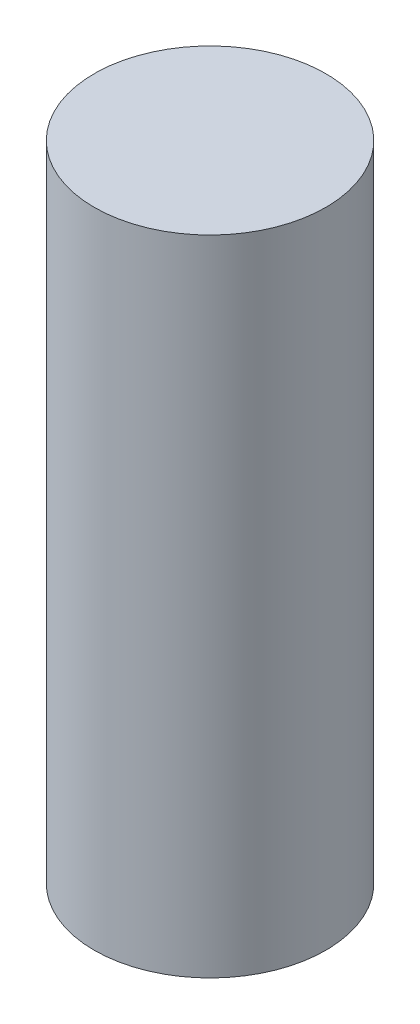
ISO-10303-21;
HEADER;
FILE_DESCRIPTION(('STEP AP214'),'2;1');
FILE_NAME('part.step','',(''),(''),'','','');
FILE_SCHEMA(('AUTOMOTIVE_DESIGN { 1 0 10303 214 1 1 1 1 }'));
ENDSEC;
DATA;
#1=APPLICATION_CONTEXT('core data for automotive mechanical design processes');
#2=APPLICATION_PROTOCOL_DEFINITION('international standard','automotive_design',2000,#1);
#3=PRODUCT_CONTEXT('',#1,'mechanical');
#4=PRODUCT('Part','Part','',(#3));
#5=PRODUCT_RELATED_PRODUCT_CATEGORY('part','',(#4));
#6=PRODUCT_DEFINITION_FORMATION('','',#4);
#7=PRODUCT_DEFINITION_CONTEXT('part definition',#1,'design');
#8=PRODUCT_DEFINITION('design','',#6,#7);
#9=PRODUCT_DEFINITION_SHAPE('','',#8);
#10=(LENGTH_UNIT() NAMED_UNIT(*) SI_UNIT(.MILLI.,.METRE.));
#11=(NAMED_UNIT(*) PLANE_ANGLE_UNIT() SI_UNIT($,.RADIAN.));
#12=(NAMED_UNIT(*) SI_UNIT($,.STERADIAN.) SOLID_ANGLE_UNIT());
#13=UNCERTAINTY_MEASURE_WITH_UNIT(LENGTH_MEASURE(1.E-05),#10,'distance_accuracy_value','');
#14=(GEOMETRIC_REPRESENTATION_CONTEXT(3) GLOBAL_UNCERTAINTY_ASSIGNED_CONTEXT((#13)) GLOBAL_UNIT_ASSIGNED_CONTEXT((#10,
#11,#12)) REPRESENTATION_CONTEXT('',''));
#15=CARTESIAN_POINT('',(0.,0.,0.));
#16=DIRECTION('',(0.,0.,1.));
#17=DIRECTION('',(1.,0.,0.));
#18=AXIS2_PLACEMENT_3D('',#15,#16,#17);
#19=CARTESIAN_POINT('',(0.,25.,0.));
#20=DIRECTION('',(0.,-1.,0.));
#21=DIRECTION('',(0.,0.,-1.));
#22=AXIS2_PLACEMENT_3D('',#19,#20,#21);
#23=CYLINDRICAL_SURFACE('',#22,4.5);
#24=CARTESIAN_POINT('',(0.,25.,0.));
#25=DIRECTION('',(0.,1.,0.));
#26=DIRECTION('',(0.,0.,1.));
#27=AXIS2_PLACEMENT_3D('',#24,#25,#26);
#28=CIRCLE('',#27,4.5);
#29=CARTESIAN_POINT('',(0.,25.,4.5));
#30=VERTEX_POINT('',#29);
#31=EDGE_CURVE('E10',#30,#30,#28,.T.);
#32=ORIENTED_EDGE('',*,*,#31,.F.);
#33=EDGE_LOOP('',(#32));
#34=FACE_BOUND('',#33,.T.);
#35=CARTESIAN_POINT('',(0.,0.,0.));
#36=DIRECTION('',(0.,1.,0.));
#37=DIRECTION('',(0.,0.,1.));
#38=AXIS2_PLACEMENT_3D('',#35,#36,#37);
#39=CIRCLE('',#38,4.5);
#40=CARTESIAN_POINT('',(0.,0.,4.5));
#41=VERTEX_POINT('',#40);
#42=EDGE_CURVE('E34',#41,#41,#39,.T.);
#43=ORIENTED_EDGE('',*,*,#42,.T.);
#44=EDGE_LOOP('',(#43));
#45=FACE_BOUND('',#44,.T.);
#46=ADVANCED_FACE('F31',(#34,#45),#23,.T.);
#47=CARTESIAN_POINT('',(0.,25.,0.));
#48=DIRECTION('',(0.,1.,0.));
#49=DIRECTION('',(0.,0.,1.));
#50=AXIS2_PLACEMENT_3D('',#47,#48,#49);
#51=PLANE('',#50);
#52=ORIENTED_EDGE('',*,*,#31,.T.);
#53=EDGE_LOOP('',(#52));
#54=FACE_BOUND('',#53,.T.);
#55=ADVANCED_FACE('F46',(#54),#51,.T.);
#56=CARTESIAN_POINT('',(0.,0.,0.));
#57=DIRECTION('',(0.,1.,0.));
#58=DIRECTION('',(0.,0.,1.));
#59=AXIS2_PLACEMENT_3D('',#56,#57,#58);
#60=PLANE('',#59);
#61=ORIENTED_EDGE('',*,*,#42,.F.);
#62=EDGE_LOOP('',(#61));
#63=FACE_BOUND('',#62,.T.);
#64=ADVANCED_FACE('F44',(#63),#60,.F.);
#65=CLOSED_SHELL('',(#46,#55,#64));
#66=MANIFOLD_SOLID_BREP('B2',#65);
#67=ADVANCED_BREP_SHAPE_REPRESENTATION('',(#18,#66),#14);
#68=SHAPE_DEFINITION_REPRESENTATION(#9,#67);
ENDSEC;
END-ISO-10303-21;
